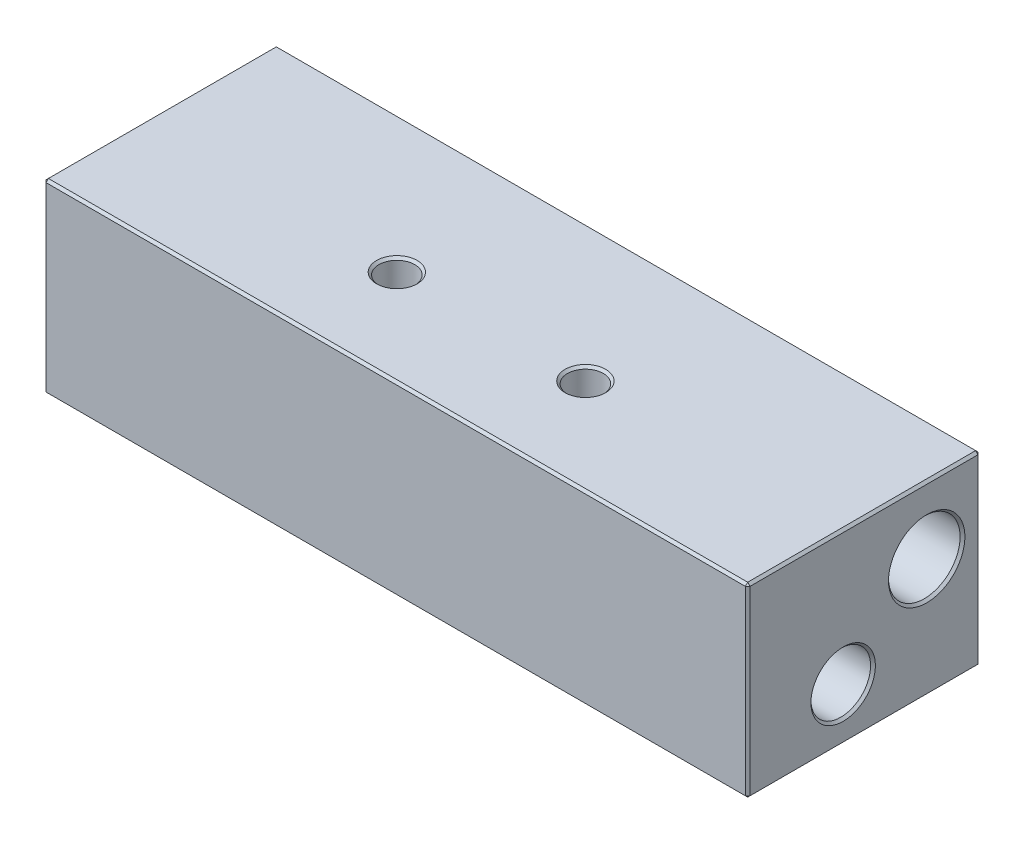
ISO-10303-21;
HEADER;
FILE_DESCRIPTION(('STEP AP214'),'2;1');
FILE_NAME('part.step','',(''),(''),'','','');
FILE_SCHEMA(('AUTOMOTIVE_DESIGN { 1 0 10303 214 1 1 1 1 }'));
ENDSEC;
DATA;
#1=APPLICATION_CONTEXT('core data for automotive mechanical design processes');
#2=APPLICATION_PROTOCOL_DEFINITION('international standard','automotive_design',2000,#1);
#3=PRODUCT_CONTEXT('',#1,'mechanical');
#4=PRODUCT('Part','Part','',(#3));
#5=PRODUCT_RELATED_PRODUCT_CATEGORY('part','',(#4));
#6=PRODUCT_DEFINITION_FORMATION('','',#4);
#7=PRODUCT_DEFINITION_CONTEXT('part definition',#1,'design');
#8=PRODUCT_DEFINITION('design','',#6,#7);
#9=PRODUCT_DEFINITION_SHAPE('','',#8);
#10=(LENGTH_UNIT() NAMED_UNIT(*) SI_UNIT(.MILLI.,.METRE.));
#11=(NAMED_UNIT(*) PLANE_ANGLE_UNIT() SI_UNIT($,.RADIAN.));
#12=(NAMED_UNIT(*) SI_UNIT($,.STERADIAN.) SOLID_ANGLE_UNIT());
#13=UNCERTAINTY_MEASURE_WITH_UNIT(LENGTH_MEASURE(1.E-05),#10,'distance_accuracy_value','');
#14=(GEOMETRIC_REPRESENTATION_CONTEXT(3) GLOBAL_UNCERTAINTY_ASSIGNED_CONTEXT((#13)) GLOBAL_UNIT_ASSIGNED_CONTEXT((#10,
#11,#12)) REPRESENTATION_CONTEXT('',''));
#15=CARTESIAN_POINT('',(0.,0.,0.));
#16=DIRECTION('',(0.,0.,1.));
#17=DIRECTION('',(1.,0.,0.));
#18=AXIS2_PLACEMENT_3D('',#15,#16,#17);
#19=CARTESIAN_POINT('',(0.,0.,19.5));
#20=DIRECTION('',(1.,0.,0.));
#21=DIRECTION('',(0.,0.,-1.));
#22=AXIS2_PLACEMENT_3D('',#19,#20,#21);
#23=PLANE('',#22);
#24=DIRECTION('',(0.,0.,-1.));
#25=VECTOR('',#24,1.);
#26=CARTESIAN_POINT('',(0.,15.4,19.5));
#27=LINE('',#26,#25);
#28=CARTESIAN_POINT('',(0.,15.4,19.3));
#29=VERTEX_POINT('',#28);
#30=CARTESIAN_POINT('',(0.,15.4,0.199999999999999));
#31=VERTEX_POINT('',#30);
#32=EDGE_CURVE('E255',#29,#31,#27,.T.);
#33=ORIENTED_EDGE('',*,*,#32,.T.);
#34=DIRECTION('',(0.,-1.,0.));
#35=VECTOR('',#34,1.);
#36=CARTESIAN_POINT('',(0.,0.,0.199999999999999));
#37=LINE('',#36,#35);
#38=CARTESIAN_POINT('',(0.,0.199999999999999,0.199999999999999));
#39=VERTEX_POINT('',#38);
#40=EDGE_CURVE('E258',#31,#39,#37,.T.);
#41=ORIENTED_EDGE('',*,*,#40,.T.);
#42=DIRECTION('',(0.,0.,1.));
#43=VECTOR('',#42,1.);
#44=CARTESIAN_POINT('',(0.,0.199999999999999,19.5));
#45=LINE('',#44,#43);
#46=CARTESIAN_POINT('',(0.,0.199999999999999,19.3));
#47=VERTEX_POINT('',#46);
#48=EDGE_CURVE('E249',#39,#47,#45,.T.);
#49=ORIENTED_EDGE('',*,*,#48,.T.);
#50=DIRECTION('',(0.,1.,0.));
#51=VECTOR('',#50,1.);
#52=CARTESIAN_POINT('',(0.,0.,19.3));
#53=LINE('',#52,#51);
#54=EDGE_CURVE('E252',#47,#29,#53,.T.);
#55=ORIENTED_EDGE('',*,*,#54,.T.);
#56=EDGE_LOOP('',(#33,#41,#49,#55));
#57=FACE_BOUND('',#56,.T.);
#58=CARTESIAN_POINT('',(0.,10.7,10.4));
#59=DIRECTION('',(-1.,0.,0.));
#60=DIRECTION('',(0.,0.,1.));
#61=AXIS2_PLACEMENT_3D('',#58,#59,#60);
#62=CIRCLE('',#61,3.);
#63=CARTESIAN_POINT('',(0.,10.7,13.4));
#64=VERTEX_POINT('',#63);
#65=EDGE_CURVE('E381',#64,#64,#62,.T.);
#66=ORIENTED_EDGE('',*,*,#65,.F.);
#67=EDGE_LOOP('',(#66));
#68=FACE_BOUND('',#67,.T.);
#69=CARTESIAN_POINT('',(0.,4.6,4.5));
#70=DIRECTION('',(-1.,0.,0.));
#71=DIRECTION('',(0.,0.,1.));
#72=AXIS2_PLACEMENT_3D('',#69,#70,#71);
#73=CIRCLE('',#72,3.);
#74=CARTESIAN_POINT('',(0.,4.6,7.5));
#75=VERTEX_POINT('',#74);
#76=EDGE_CURVE('E367',#75,#75,#73,.T.);
#77=ORIENTED_EDGE('',*,*,#76,.F.);
#78=EDGE_LOOP('',(#77));
#79=FACE_BOUND('',#78,.T.);
#80=ADVANCED_FACE('F41',(#57,#68,#79),#23,.F.);
#81=CARTESIAN_POINT('',(0.,0.,19.5));
#82=DIRECTION('',(0.,1.,0.));
#83=DIRECTION('',(0.,0.,1.));
#84=AXIS2_PLACEMENT_3D('',#81,#82,#83);
#85=PLANE('',#84);
#86=DIRECTION('',(0.,0.,-1.));
#87=VECTOR('',#86,1.);
#88=CARTESIAN_POINT('',(0.199999999999992,0.,19.5));
#89=LINE('',#88,#87);
#90=CARTESIAN_POINT('',(0.199999999999992,0.,19.3));
#91=VERTEX_POINT('',#90);
#92=CARTESIAN_POINT('',(0.199999999999992,0.,0.199999999999992));
#93=VERTEX_POINT('',#92);
#94=EDGE_CURVE('E202',#91,#93,#89,.T.);
#95=ORIENTED_EDGE('',*,*,#94,.T.);
#96=DIRECTION('',(1.,0.,0.));
#97=VECTOR('',#96,1.);
#98=CARTESIAN_POINT('',(59.,0.,0.199999999999992));
#99=LINE('',#98,#97);
#100=CARTESIAN_POINT('',(58.8,0.,0.199999999999992));
#101=VERTEX_POINT('',#100);
#102=EDGE_CURVE('E211',#93,#101,#99,.T.);
#103=ORIENTED_EDGE('',*,*,#102,.T.);
#104=DIRECTION('',(0.,0.,1.));
#105=VECTOR('',#104,1.);
#106=CARTESIAN_POINT('',(58.8,0.,19.5));
#107=LINE('',#106,#105);
#108=CARTESIAN_POINT('',(58.8,0.,19.3));
#109=VERTEX_POINT('',#108);
#110=EDGE_CURVE('E208',#101,#109,#107,.T.);
#111=ORIENTED_EDGE('',*,*,#110,.T.);
#112=DIRECTION('',(-1.,0.,0.));
#113=VECTOR('',#112,1.);
#114=CARTESIAN_POINT('',(0.,0.,19.3));
#115=LINE('',#114,#113);
#116=EDGE_CURVE('E205',#109,#91,#115,.T.);
#117=ORIENTED_EDGE('',*,*,#116,.T.);
#118=EDGE_LOOP('',(#95,#103,#111,#117));
#119=FACE_BOUND('',#118,.T.);
#120=CARTESIAN_POINT('',(37.4,0.,11.5));
#121=DIRECTION('',(0.,1.,0.));
#122=DIRECTION('',(0.,0.,1.));
#123=AXIS2_PLACEMENT_3D('',#120,#121,#122);
#124=CIRCLE('',#123,1.69999999999999);
#125=CARTESIAN_POINT('',(37.4,0.,13.2));
#126=VERTEX_POINT('',#125);
#127=EDGE_CURVE('E198',#126,#126,#124,.T.);
#128=ORIENTED_EDGE('',*,*,#127,.T.);
#129=EDGE_LOOP('',(#128));
#130=FACE_BOUND('',#129,.T.);
#131=CARTESIAN_POINT('',(21.6,0.,11.5));
#132=DIRECTION('',(0.,1.,0.));
#133=DIRECTION('',(0.,0.,1.));
#134=AXIS2_PLACEMENT_3D('',#131,#132,#133);
#135=CIRCLE('',#134,1.69999999999999);
#136=CARTESIAN_POINT('',(21.6,0.,13.2));
#137=VERTEX_POINT('',#136);
#138=EDGE_CURVE('E194',#137,#137,#135,.T.);
#139=ORIENTED_EDGE('',*,*,#138,.T.);
#140=EDGE_LOOP('',(#139));
#141=FACE_BOUND('',#140,.T.);
#142=ADVANCED_FACE('F417',(#119,#130,#141),#85,.F.);
#143=CARTESIAN_POINT('',(59.,0.,19.5));
#144=DIRECTION('',(-1.,0.,0.));
#145=DIRECTION('',(0.,0.,1.));
#146=AXIS2_PLACEMENT_3D('',#143,#144,#145);
#147=PLANE('',#146);
#148=CARTESIAN_POINT('',(59.,10.,4.5));
#149=DIRECTION('',(-1.,0.,0.));
#150=DIRECTION('',(0.,0.,1.));
#151=AXIS2_PLACEMENT_3D('',#148,#149,#150);
#152=CIRCLE('',#151,3.19999999999999);
#153=CARTESIAN_POINT('',(59.,10.,7.69999999999999));
#154=VERTEX_POINT('',#153);
#155=EDGE_CURVE('E186',#154,#154,#152,.T.);
#156=ORIENTED_EDGE('',*,*,#155,.T.);
#157=EDGE_LOOP('',(#156));
#158=FACE_BOUND('',#157,.T.);
#159=DIRECTION('',(0.,0.,-1.));
#160=VECTOR('',#159,1.);
#161=CARTESIAN_POINT('',(59.,0.199999999999999,19.5));
#162=LINE('',#161,#160);
#163=CARTESIAN_POINT('',(59.,0.199999999999999,19.3));
#164=VERTEX_POINT('',#163);
#165=CARTESIAN_POINT('',(59.,0.199999999999999,0.199999999999992));
#166=VERTEX_POINT('',#165);
#167=EDGE_CURVE('E138',#164,#166,#162,.T.);
#168=ORIENTED_EDGE('',*,*,#167,.T.);
#169=DIRECTION('',(0.,1.,0.));
#170=VECTOR('',#169,1.);
#171=CARTESIAN_POINT('',(59.,15.6,0.199999999999992));
#172=LINE('',#171,#170);
#173=CARTESIAN_POINT('',(59.,15.4,0.199999999999992));
#174=VERTEX_POINT('',#173);
#175=EDGE_CURVE('E183',#166,#174,#172,.T.);
#176=ORIENTED_EDGE('',*,*,#175,.T.);
#177=DIRECTION('',(0.,0.,1.));
#178=VECTOR('',#177,1.);
#179=CARTESIAN_POINT('',(59.,15.4,19.5));
#180=LINE('',#179,#178);
#181=CARTESIAN_POINT('',(59.,15.4,19.3));
#182=VERTEX_POINT('',#181);
#183=EDGE_CURVE('E141',#174,#182,#180,.T.);
#184=ORIENTED_EDGE('',*,*,#183,.T.);
#185=DIRECTION('',(0.,-1.,0.));
#186=VECTOR('',#185,1.);
#187=CARTESIAN_POINT('',(59.,0.,19.3));
#188=LINE('',#187,#186);
#189=EDGE_CURVE('E132',#182,#164,#188,.T.);
#190=ORIENTED_EDGE('',*,*,#189,.T.);
#191=EDGE_LOOP('',(#168,#176,#184,#190));
#192=FACE_BOUND('',#191,.T.);
#193=CARTESIAN_POINT('',(59.,4.4,11.5));
#194=DIRECTION('',(-1.,0.,0.));
#195=DIRECTION('',(0.,0.,1.));
#196=AXIS2_PLACEMENT_3D('',#193,#194,#195);
#197=CIRCLE('',#196,2.70000000000001);
#198=CARTESIAN_POINT('',(59.,4.4,14.2));
#199=VERTEX_POINT('',#198);
#200=EDGE_CURVE('E173',#199,#199,#197,.T.);
#201=ORIENTED_EDGE('',*,*,#200,.T.);
#202=EDGE_LOOP('',(#201));
#203=FACE_BOUND('',#202,.T.);
#204=ADVANCED_FACE('F134',(#158,#192,#203),#147,.F.);
#205=CARTESIAN_POINT('',(0.,15.6,19.5));
#206=DIRECTION('',(0.,-1.,0.));
#207=DIRECTION('',(0.,0.,-1.));
#208=AXIS2_PLACEMENT_3D('',#205,#206,#207);
#209=PLANE('',#208);
#210=DIRECTION('',(1.,0.,0.));
#211=VECTOR('',#210,1.);
#212=CARTESIAN_POINT('',(0.,15.6,19.3));
#213=LINE('',#212,#211);
#214=CARTESIAN_POINT('',(0.199999999999992,15.6,19.3));
#215=VERTEX_POINT('',#214);
#216=CARTESIAN_POINT('',(58.8,15.6,19.3));
#217=VERTEX_POINT('',#216);
#218=EDGE_CURVE('E239',#215,#217,#213,.T.);
#219=ORIENTED_EDGE('',*,*,#218,.T.);
#220=DIRECTION('',(0.,0.,-1.));
#221=VECTOR('',#220,1.);
#222=CARTESIAN_POINT('',(58.8,15.6,19.5));
#223=LINE('',#222,#221);
#224=CARTESIAN_POINT('',(58.8,15.6,0.199999999999992));
#225=VERTEX_POINT('',#224);
#226=EDGE_CURVE('E246',#217,#225,#223,.T.);
#227=ORIENTED_EDGE('',*,*,#226,.T.);
#228=DIRECTION('',(-1.,0.,0.));
#229=VECTOR('',#228,1.);
#230=CARTESIAN_POINT('',(0.,15.6,0.199999999999992));
#231=LINE('',#230,#229);
#232=CARTESIAN_POINT('',(0.199999999999992,15.6,0.199999999999992));
#233=VERTEX_POINT('',#232);
#234=EDGE_CURVE('E242',#225,#233,#231,.T.);
#235=ORIENTED_EDGE('',*,*,#234,.T.);
#236=DIRECTION('',(0.,0.,1.));
#237=VECTOR('',#236,1.);
#238=CARTESIAN_POINT('',(0.199999999999992,15.6,19.5));
#239=LINE('',#238,#237);
#240=EDGE_CURVE('E236',#233,#215,#239,.T.);
#241=ORIENTED_EDGE('',*,*,#240,.T.);
#242=EDGE_LOOP('',(#219,#227,#235,#241));
#243=FACE_BOUND('',#242,.T.);
#244=CARTESIAN_POINT('',(37.4,15.6,11.5));
#245=DIRECTION('',(0.,-1.,0.));
#246=DIRECTION('',(0.,0.,-1.));
#247=AXIS2_PLACEMENT_3D('',#244,#245,#246);
#248=CIRCLE('',#247,1.7);
#249=CARTESIAN_POINT('',(37.4,15.6,9.8));
#250=VERTEX_POINT('',#249);
#251=EDGE_CURVE('E232',#250,#250,#248,.T.);
#252=ORIENTED_EDGE('',*,*,#251,.T.);
#253=EDGE_LOOP('',(#252));
#254=FACE_BOUND('',#253,.T.);
#255=CARTESIAN_POINT('',(21.6,15.6,11.5));
#256=DIRECTION('',(0.,-1.,0.));
#257=DIRECTION('',(0.,0.,-1.));
#258=AXIS2_PLACEMENT_3D('',#255,#256,#257);
#259=CIRCLE('',#258,1.7);
#260=CARTESIAN_POINT('',(21.6,15.6,9.8));
#261=VERTEX_POINT('',#260);
#262=EDGE_CURVE('E228',#261,#261,#259,.T.);
#263=ORIENTED_EDGE('',*,*,#262,.T.);
#264=EDGE_LOOP('',(#263));
#265=FACE_BOUND('',#264,.T.);
#266=ADVANCED_FACE('F428',(#243,#254,#265),#209,.F.);
#267=CARTESIAN_POINT('',(0.,0.,19.5));
#268=DIRECTION('',(0.,0.,-1.));
#269=DIRECTION('',(-1.,0.,0.));
#270=AXIS2_PLACEMENT_3D('',#267,#268,#269);
#271=PLANE('',#270);
#272=DIRECTION('',(0.,1.,0.));
#273=VECTOR('',#272,1.);
#274=CARTESIAN_POINT('',(58.8,0.,19.5));
#275=LINE('',#274,#273);
#276=CARTESIAN_POINT('',(58.8,0.199999999999999,19.5));
#277=VERTEX_POINT('',#276);
#278=CARTESIAN_POINT('',(58.8,15.4,19.5));
#279=VERTEX_POINT('',#278);
#280=EDGE_CURVE('E60',#277,#279,#275,.T.);
#281=ORIENTED_EDGE('',*,*,#280,.T.);
#282=DIRECTION('',(-1.,0.,0.));
#283=VECTOR('',#282,1.);
#284=CARTESIAN_POINT('',(0.,15.4,19.5));
#285=LINE('',#284,#283);
#286=CARTESIAN_POINT('',(0.199999999999992,15.4,19.5));
#287=VERTEX_POINT('',#286);
#288=EDGE_CURVE('E269',#279,#287,#285,.T.);
#289=ORIENTED_EDGE('',*,*,#288,.T.);
#290=DIRECTION('',(0.,-1.,0.));
#291=VECTOR('',#290,1.);
#292=CARTESIAN_POINT('',(0.199999999999992,0.,19.5));
#293=LINE('',#292,#291);
#294=CARTESIAN_POINT('',(0.199999999999992,0.199999999999999,19.5));
#295=VERTEX_POINT('',#294);
#296=EDGE_CURVE('E262',#287,#295,#293,.T.);
#297=ORIENTED_EDGE('',*,*,#296,.T.);
#298=DIRECTION('',(1.,0.,0.));
#299=VECTOR('',#298,1.);
#300=CARTESIAN_POINT('',(0.,0.199999999999999,19.5));
#301=LINE('',#300,#299);
#302=EDGE_CURVE('E65',#295,#277,#301,.T.);
#303=ORIENTED_EDGE('',*,*,#302,.T.);
#304=EDGE_LOOP('',(#281,#289,#297,#303));
#305=FACE_BOUND('',#304,.T.);
#306=ADVANCED_FACE('F432',(#305),#271,.F.);
#307=CARTESIAN_POINT('',(0.,0.,0.));
#308=DIRECTION('',(0.,0.,-1.));
#309=DIRECTION('',(-1.,0.,0.));
#310=AXIS2_PLACEMENT_3D('',#307,#308,#309);
#311=PLANE('',#310);
#312=DIRECTION('',(0.,-1.,0.));
#313=VECTOR('',#312,1.);
#314=CARTESIAN_POINT('',(58.8,0.,0.));
#315=LINE('',#314,#313);
#316=CARTESIAN_POINT('',(58.8,15.4,0.));
#317=VERTEX_POINT('',#316);
#318=CARTESIAN_POINT('',(58.8,0.199999999999999,0.));
#319=VERTEX_POINT('',#318);
#320=EDGE_CURVE('E221',#317,#319,#315,.T.);
#321=ORIENTED_EDGE('',*,*,#320,.T.);
#322=DIRECTION('',(-1.,0.,0.));
#323=VECTOR('',#322,1.);
#324=CARTESIAN_POINT('',(0.,0.199999999999999,0.));
#325=LINE('',#324,#323);
#326=CARTESIAN_POINT('',(0.199999999999992,0.199999999999999,0.));
#327=VERTEX_POINT('',#326);
#328=EDGE_CURVE('E224',#319,#327,#325,.T.);
#329=ORIENTED_EDGE('',*,*,#328,.T.);
#330=DIRECTION('',(0.,1.,0.));
#331=VECTOR('',#330,1.);
#332=CARTESIAN_POINT('',(0.199999999999992,15.6,0.));
#333=LINE('',#332,#331);
#334=CARTESIAN_POINT('',(0.199999999999992,15.4,0.));
#335=VERTEX_POINT('',#334);
#336=EDGE_CURVE('E215',#327,#335,#333,.T.);
#337=ORIENTED_EDGE('',*,*,#336,.T.);
#338=DIRECTION('',(1.,0.,0.));
#339=VECTOR('',#338,1.);
#340=CARTESIAN_POINT('',(59.,15.4,0.));
#341=LINE('',#340,#339);
#342=EDGE_CURVE('E218',#335,#317,#341,.T.);
#343=ORIENTED_EDGE('',*,*,#342,.T.);
#344=EDGE_LOOP('',(#321,#329,#337,#343));
#345=FACE_BOUND('',#344,.T.);
#346=ADVANCED_FACE('F434',(#345),#311,.T.);
#347=CARTESIAN_POINT('',(2.,4.6,4.5));
#348=DIRECTION('',(-1.,0.,0.));
#349=DIRECTION('',(0.,0.,1.));
#350=AXIS2_PLACEMENT_3D('',#347,#348,#349);
#351=CYLINDRICAL_SURFACE('',#350,3.);
#352=CARTESIAN_POINT('',(2.,4.6,4.5));
#353=DIRECTION('',(-1.,0.,0.));
#354=DIRECTION('',(0.,0.,1.));
#355=AXIS2_PLACEMENT_3D('',#352,#353,#354);
#356=CIRCLE('',#355,3.);
#357=CARTESIAN_POINT('',(2.,4.6,7.5));
#358=VERTEX_POINT('',#357);
#359=EDGE_CURVE('E373',#358,#358,#356,.T.);
#360=ORIENTED_EDGE('',*,*,#359,.F.);
#361=EDGE_LOOP('',(#360));
#362=FACE_BOUND('',#361,.T.);
#363=ORIENTED_EDGE('',*,*,#76,.T.);
#364=EDGE_LOOP('',(#363));
#365=FACE_BOUND('',#364,.T.);
#366=ADVANCED_FACE('F437',(#362,#365),#351,.F.);
#367=CARTESIAN_POINT('',(2.,4.6,4.5));
#368=DIRECTION('',(-1.,0.,0.));
#369=DIRECTION('',(0.,0.,1.));
#370=AXIS2_PLACEMENT_3D('',#367,#368,#369);
#371=PLANE('',#370);
#372=ORIENTED_EDGE('',*,*,#359,.T.);
#373=EDGE_LOOP('',(#372));
#374=FACE_BOUND('',#373,.T.);
#375=ADVANCED_FACE('F443',(#374),#371,.T.);
#376=CARTESIAN_POINT('',(2.,10.7,10.4));
#377=DIRECTION('',(-1.,0.,0.));
#378=DIRECTION('',(0.,0.,1.));
#379=AXIS2_PLACEMENT_3D('',#376,#377,#378);
#380=CYLINDRICAL_SURFACE('',#379,3.);
#381=CARTESIAN_POINT('',(2.,10.7,10.4));
#382=DIRECTION('',(-1.,0.,0.));
#383=DIRECTION('',(0.,0.,1.));
#384=AXIS2_PLACEMENT_3D('',#381,#382,#383);
#385=CIRCLE('',#384,3.);
#386=CARTESIAN_POINT('',(2.,10.7,13.4));
#387=VERTEX_POINT('',#386);
#388=EDGE_CURVE('E376',#387,#387,#385,.T.);
#389=ORIENTED_EDGE('',*,*,#388,.F.);
#390=EDGE_LOOP('',(#389));
#391=FACE_BOUND('',#390,.T.);
#392=ORIENTED_EDGE('',*,*,#65,.T.);
#393=EDGE_LOOP('',(#392));
#394=FACE_BOUND('',#393,.T.);
#395=ADVANCED_FACE('F447',(#391,#394),#380,.F.);
#396=CARTESIAN_POINT('',(2.,10.7,10.4));
#397=DIRECTION('',(-1.,0.,0.));
#398=DIRECTION('',(0.,0.,1.));
#399=AXIS2_PLACEMENT_3D('',#396,#397,#398);
#400=PLANE('',#399);
#401=ORIENTED_EDGE('',*,*,#388,.T.);
#402=EDGE_LOOP('',(#401));
#403=FACE_BOUND('',#402,.T.);
#404=ADVANCED_FACE('F451',(#403),#400,.T.);
#405=CARTESIAN_POINT('',(54.,4.4,11.5));
#406=DIRECTION('',(1.,0.,0.));
#407=DIRECTION('',(0.,0.,-1.));
#408=AXIS2_PLACEMENT_3D('',#405,#406,#407);
#409=CYLINDRICAL_SURFACE('',#408,2.5);
#410=CARTESIAN_POINT('',(58.8,4.4,11.5));
#411=DIRECTION('',(-1.,0.,0.));
#412=DIRECTION('',(0.,0.,1.));
#413=AXIS2_PLACEMENT_3D('',#410,#411,#412);
#414=CIRCLE('',#413,2.5);
#415=CARTESIAN_POINT('',(58.8,4.4,14.));
#416=VERTEX_POINT('',#415);
#417=EDGE_CURVE('E272',#416,#416,#414,.F.);
#418=ORIENTED_EDGE('',*,*,#417,.T.);
#419=EDGE_LOOP('',(#418));
#420=FACE_BOUND('',#419,.T.);
#421=CARTESIAN_POINT('',(54.,4.4,11.5));
#422=DIRECTION('',(1.,0.,0.));
#423=DIRECTION('',(0.,0.,-1.));
#424=AXIS2_PLACEMENT_3D('',#421,#422,#423);
#425=CIRCLE('',#424,2.5);
#426=CARTESIAN_POINT('',(54.,4.4,9.));
#427=VERTEX_POINT('',#426);
#428=EDGE_CURVE('E360',#427,#427,#425,.T.);
#429=ORIENTED_EDGE('',*,*,#428,.F.);
#430=EDGE_LOOP('',(#429));
#431=FACE_BOUND('',#430,.T.);
#432=ADVANCED_FACE('F455',(#420,#431),#409,.F.);
#433=CARTESIAN_POINT('',(54.,4.4,11.5));
#434=DIRECTION('',(1.,0.,0.));
#435=DIRECTION('',(0.,0.,-1.));
#436=AXIS2_PLACEMENT_3D('',#433,#434,#435);
#437=PLANE('',#436);
#438=ORIENTED_EDGE('',*,*,#428,.T.);
#439=EDGE_LOOP('',(#438));
#440=FACE_BOUND('',#439,.T.);
#441=ADVANCED_FACE('F459',(#440),#437,.T.);
#442=CARTESIAN_POINT('',(54.,10.,4.5));
#443=DIRECTION('',(1.,0.,0.));
#444=DIRECTION('',(0.,0.,-1.));
#445=AXIS2_PLACEMENT_3D('',#442,#443,#444);
#446=CYLINDRICAL_SURFACE('',#445,3.);
#447=CARTESIAN_POINT('',(58.8,10.,4.5));
#448=DIRECTION('',(-1.,0.,0.));
#449=DIRECTION('',(0.,0.,1.));
#450=AXIS2_PLACEMENT_3D('',#447,#448,#449);
#451=CIRCLE('',#450,3.);
#452=CARTESIAN_POINT('',(58.8,10.,7.5));
#453=VERTEX_POINT('',#452);
#454=EDGE_CURVE('E177',#453,#453,#451,.F.);
#455=ORIENTED_EDGE('',*,*,#454,.T.);
#456=EDGE_LOOP('',(#455));
#457=FACE_BOUND('',#456,.T.);
#458=CARTESIAN_POINT('',(54.2,10.,4.5));
#459=DIRECTION('',(1.,0.,0.));
#460=DIRECTION('',(0.,0.,-1.));
#461=AXIS2_PLACEMENT_3D('',#458,#459,#460);
#462=CIRCLE('',#461,3.);
#463=CARTESIAN_POINT('',(54.2,10.,1.5));
#464=VERTEX_POINT('',#463);
#465=EDGE_CURVE('E380',#464,#464,#462,.F.);
#466=ORIENTED_EDGE('',*,*,#465,.T.);
#467=EDGE_LOOP('',(#466));
#468=FACE_BOUND('',#467,.T.);
#469=ADVANCED_FACE('F394',(#457,#468),#446,.F.);
#470=CARTESIAN_POINT('',(54.,10.,4.5));
#471=DIRECTION('',(1.,0.,0.));
#472=DIRECTION('',(0.,0.,-1.));
#473=AXIS2_PLACEMENT_3D('',#470,#471,#472);
#474=PLANE('',#473);
#475=CARTESIAN_POINT('',(54.,10.,4.5));
#476=DIRECTION('',(1.,0.,0.));
#477=DIRECTION('',(0.,0.,-1.));
#478=AXIS2_PLACEMENT_3D('',#475,#476,#477);
#479=CIRCLE('',#478,2.8);
#480=CARTESIAN_POINT('',(54.,10.,1.7));
#481=VERTEX_POINT('',#480);
#482=EDGE_CURVE('E190',#481,#481,#479,.T.);
#483=ORIENTED_EDGE('',*,*,#482,.T.);
#484=EDGE_LOOP('',(#483));
#485=FACE_BOUND('',#484,.T.);
#486=ADVANCED_FACE('F465',(#485),#474,.T.);
#487=CARTESIAN_POINT('',(37.4,15.6,11.5));
#488=DIRECTION('',(0.,-1.,0.));
#489=DIRECTION('',(0.,0.,-1.));
#490=AXIS2_PLACEMENT_3D('',#487,#488,#489);
#491=CYLINDRICAL_SURFACE('',#490,1.5);
#492=CARTESIAN_POINT('',(37.4,15.4,11.5));
#493=DIRECTION('',(0.,-1.,0.));
#494=DIRECTION('',(0.,0.,-1.));
#495=AXIS2_PLACEMENT_3D('',#492,#493,#494);
#496=CIRCLE('',#495,1.5);
#497=CARTESIAN_POINT('',(37.4,15.4,10.));
#498=VERTEX_POINT('',#497);
#499=EDGE_CURVE('E280',#498,#498,#496,.F.);
#500=ORIENTED_EDGE('',*,*,#499,.T.);
#501=EDGE_LOOP('',(#500));
#502=FACE_BOUND('',#501,.T.);
#503=CARTESIAN_POINT('',(37.4,0.199999999999987,11.5));
#504=DIRECTION('',(0.,1.,0.));
#505=DIRECTION('',(0.,0.,1.));
#506=AXIS2_PLACEMENT_3D('',#503,#504,#505);
#507=CIRCLE('',#506,1.5);
#508=CARTESIAN_POINT('',(37.4,0.199999999999987,13.));
#509=VERTEX_POINT('',#508);
#510=EDGE_CURVE('E276',#509,#509,#507,.F.);
#511=ORIENTED_EDGE('',*,*,#510,.T.);
#512=EDGE_LOOP('',(#511));
#513=FACE_BOUND('',#512,.T.);
#514=ADVANCED_FACE('F410',(#502,#513),#491,.F.);
#515=CARTESIAN_POINT('',(21.6,15.6,11.5));
#516=DIRECTION('',(0.,-1.,0.));
#517=DIRECTION('',(0.,0.,-1.));
#518=AXIS2_PLACEMENT_3D('',#515,#516,#517);
#519=CYLINDRICAL_SURFACE('',#518,1.5);
#520=CARTESIAN_POINT('',(21.6,15.4,11.5));
#521=DIRECTION('',(0.,-1.,0.));
#522=DIRECTION('',(0.,0.,-1.));
#523=AXIS2_PLACEMENT_3D('',#520,#521,#522);
#524=CIRCLE('',#523,1.5);
#525=CARTESIAN_POINT('',(21.6,15.4,10.));
#526=VERTEX_POINT('',#525);
#527=EDGE_CURVE('E11',#526,#526,#524,.F.);
#528=ORIENTED_EDGE('',*,*,#527,.T.);
#529=EDGE_LOOP('',(#528));
#530=FACE_BOUND('',#529,.T.);
#531=CARTESIAN_POINT('',(21.6,0.19999999999999,11.5));
#532=DIRECTION('',(0.,1.,0.));
#533=DIRECTION('',(0.,0.,1.));
#534=AXIS2_PLACEMENT_3D('',#531,#532,#533);
#535=CIRCLE('',#534,1.5);
#536=CARTESIAN_POINT('',(21.6,0.19999999999999,13.));
#537=VERTEX_POINT('',#536);
#538=EDGE_CURVE('E52',#537,#537,#535,.F.);
#539=ORIENTED_EDGE('',*,*,#538,.T.);
#540=EDGE_LOOP('',(#539));
#541=FACE_BOUND('',#540,.T.);
#542=ADVANCED_FACE('F400',(#530,#541),#519,.F.);
#543=CARTESIAN_POINT('',(58.8,10.,4.5));
#544=DIRECTION('',(1.,0.,0.));
#545=DIRECTION('',(0.,0.,-1.));
#546=AXIS2_PLACEMENT_3D('',#543,#544,#545);
#547=CONICAL_SURFACE('',#546,3.,0.785398163397451);
#548=ORIENTED_EDGE('',*,*,#155,.F.);
#549=EDGE_LOOP('',(#548));
#550=FACE_BOUND('',#549,.T.);
#551=ORIENTED_EDGE('',*,*,#454,.F.);
#552=EDGE_LOOP('',(#551));
#553=FACE_BOUND('',#552,.T.);
#554=ADVANCED_FACE('F397',(#550,#553),#547,.F.);
#555=CARTESIAN_POINT('',(54.,10.,4.5));
#556=DIRECTION('',(1.,0.,0.));
#557=DIRECTION('',(0.,0.,-1.));
#558=AXIS2_PLACEMENT_3D('',#555,#556,#557);
#559=CONICAL_SURFACE('',#558,2.8,0.785398163397462);
#560=ORIENTED_EDGE('',*,*,#465,.F.);
#561=EDGE_LOOP('',(#560));
#562=FACE_BOUND('',#561,.T.);
#563=ORIENTED_EDGE('',*,*,#482,.F.);
#564=EDGE_LOOP('',(#563));
#565=FACE_BOUND('',#564,.T.);
#566=ADVANCED_FACE('F399',(#562,#565),#559,.F.);
#567=CARTESIAN_POINT('',(0.,15.4,19.5));
#568=DIRECTION('',(0.,-0.70710678118656,-0.707106781186535));
#569=DIRECTION('',(-1.,0.,0.));
#570=AXIS2_PLACEMENT_3D('',#567,#568,#569);
#571=PLANE('',#570);
#572=DIRECTION('',(0.,-0.707106781186535,0.70710678118656));
#573=VECTOR('',#572,1.);
#574=CARTESIAN_POINT('',(0.199999999999992,15.4,19.5));
#575=LINE('',#574,#573);
#576=EDGE_CURVE('E46',#287,#215,#575,.F.);
#577=ORIENTED_EDGE('',*,*,#576,.F.);
#578=ORIENTED_EDGE('',*,*,#288,.F.);
#579=DIRECTION('',(0.,0.707106781186535,-0.70710678118656));
#580=VECTOR('',#579,1.);
#581=CARTESIAN_POINT('',(58.8,15.6,19.3));
#582=LINE('',#581,#580);
#583=EDGE_CURVE('E351',#217,#279,#582,.F.);
#584=ORIENTED_EDGE('',*,*,#583,.F.);
#585=ORIENTED_EDGE('',*,*,#218,.F.);
#586=EDGE_LOOP('',(#577,#578,#584,#585));
#587=FACE_BOUND('',#586,.T.);
#588=ADVANCED_FACE('F407',(#587),#571,.F.);
#589=CARTESIAN_POINT('',(0.199999999999992,15.4,19.5));
#590=DIRECTION('',(-0.577350269189646,0.577350269189626,0.577350269189606));
#591=DIRECTION('',(-0.707106781186535,-0.70710678118656,0.));
#592=AXIS2_PLACEMENT_3D('',#589,#590,#591);
#593=PLANE('',#592);
#594=DIRECTION('',(-0.707106781186535,0.,-0.70710678118656));
#595=VECTOR('',#594,1.);
#596=CARTESIAN_POINT('',(0.199999999999992,15.4,19.5));
#597=LINE('',#596,#595);
#598=EDGE_CURVE('E344',#287,#29,#597,.T.);
#599=ORIENTED_EDGE('',*,*,#598,.F.);
#600=ORIENTED_EDGE('',*,*,#576,.T.);
#601=DIRECTION('',(0.707106781186535,0.70710678118656,0.));
#602=VECTOR('',#601,1.);
#603=CARTESIAN_POINT('',(0.0999999999999959,15.5,19.3));
#604=LINE('',#603,#602);
#605=EDGE_CURVE('E348',#29,#215,#604,.T.);
#606=ORIENTED_EDGE('',*,*,#605,.F.);
#607=EDGE_LOOP('',(#599,#600,#606));
#608=FACE_BOUND('',#607,.T.);
#609=ADVANCED_FACE('F519',(#608),#593,.T.);
#610=CARTESIAN_POINT('',(58.8,15.6,19.3));
#611=DIRECTION('',(0.577350269189646,0.577350269189626,0.577350269189606));
#612=DIRECTION('',(-0.707106781186535,0.70710678118656,0.));
#613=AXIS2_PLACEMENT_3D('',#610,#611,#612);
#614=PLANE('',#613);
#615=DIRECTION('',(0.707106781186535,-0.70710678118656,0.));
#616=VECTOR('',#615,1.);
#617=CARTESIAN_POINT('',(58.8,15.6,19.3));
#618=LINE('',#617,#616);
#619=EDGE_CURVE('E338',#217,#182,#618,.T.);
#620=ORIENTED_EDGE('',*,*,#619,.F.);
#621=ORIENTED_EDGE('',*,*,#583,.T.);
#622=DIRECTION('',(-0.707106781186535,0.,0.70710678118656));
#623=VECTOR('',#622,1.);
#624=CARTESIAN_POINT('',(58.9,15.4,19.4));
#625=LINE('',#624,#623);
#626=EDGE_CURVE('E341',#182,#279,#625,.T.);
#627=ORIENTED_EDGE('',*,*,#626,.F.);
#628=EDGE_LOOP('',(#620,#621,#627));
#629=FACE_BOUND('',#628,.T.);
#630=ADVANCED_FACE('F526',(#629),#614,.T.);
#631=CARTESIAN_POINT('',(0.,15.4,19.5));
#632=DIRECTION('',(0.70710678118656,-0.707106781186535,0.));
#633=DIRECTION('',(0.,0.,-1.));
#634=AXIS2_PLACEMENT_3D('',#631,#632,#633);
#635=PLANE('',#634);
#636=ORIENTED_EDGE('',*,*,#605,.T.);
#637=ORIENTED_EDGE('',*,*,#240,.F.);
#638=DIRECTION('',(-0.707106781186535,-0.70710678118656,0.));
#639=VECTOR('',#638,1.);
#640=CARTESIAN_POINT('',(0.199999999999992,15.6,0.199999999999992));
#641=LINE('',#640,#639);
#642=EDGE_CURVE('E331',#31,#233,#641,.F.);
#643=ORIENTED_EDGE('',*,*,#642,.F.);
#644=ORIENTED_EDGE('',*,*,#32,.F.);
#645=EDGE_LOOP('',(#636,#637,#643,#644));
#646=FACE_BOUND('',#645,.T.);
#647=ADVANCED_FACE('F532',(#646),#635,.F.);
#648=CARTESIAN_POINT('',(0.199999999999992,0.,19.5));
#649=DIRECTION('',(0.70710678118656,0.,-0.707106781186535));
#650=DIRECTION('',(0.,-1.,0.));
#651=AXIS2_PLACEMENT_3D('',#648,#649,#650);
#652=PLANE('',#651);
#653=ORIENTED_EDGE('',*,*,#598,.T.);
#654=ORIENTED_EDGE('',*,*,#54,.F.);
#655=DIRECTION('',(0.707106781186535,0.,0.70710678118656));
#656=VECTOR('',#655,1.);
#657=CARTESIAN_POINT('',(0.0999999999999959,0.199999999999999,19.4));
#658=LINE('',#657,#656);
#659=EDGE_CURVE('E327',#295,#47,#658,.F.);
#660=ORIENTED_EDGE('',*,*,#659,.F.);
#661=ORIENTED_EDGE('',*,*,#296,.F.);
#662=EDGE_LOOP('',(#653,#654,#660,#661));
#663=FACE_BOUND('',#662,.T.);
#664=ADVANCED_FACE('F538',(#663),#652,.F.);
#665=CARTESIAN_POINT('',(0.,0.199999999999999,19.5));
#666=DIRECTION('',(0.,0.707106781186535,-0.70710678118656));
#667=DIRECTION('',(1.,0.,0.));
#668=AXIS2_PLACEMENT_3D('',#665,#666,#667);
#669=PLANE('',#668);
#670=DIRECTION('',(0.,0.70710678118656,0.707106781186535));
#671=VECTOR('',#670,1.);
#672=CARTESIAN_POINT('',(58.8,0.0999999999999994,19.4));
#673=LINE('',#672,#671);
#674=EDGE_CURVE('E155',#277,#109,#673,.F.);
#675=ORIENTED_EDGE('',*,*,#674,.F.);
#676=ORIENTED_EDGE('',*,*,#302,.F.);
#677=DIRECTION('',(0.,-0.70710678118656,-0.707106781186535));
#678=VECTOR('',#677,1.);
#679=CARTESIAN_POINT('',(0.199999999999992,0.,19.3));
#680=LINE('',#679,#678);
#681=EDGE_CURVE('E323',#91,#295,#680,.F.);
#682=ORIENTED_EDGE('',*,*,#681,.F.);
#683=ORIENTED_EDGE('',*,*,#116,.F.);
#684=EDGE_LOOP('',(#675,#676,#682,#683));
#685=FACE_BOUND('',#684,.T.);
#686=ADVANCED_FACE('F545',(#685),#669,.F.);
#687=CARTESIAN_POINT('',(58.8,0.,19.5));
#688=DIRECTION('',(-0.70710678118656,0.,-0.707106781186535));
#689=DIRECTION('',(0.,1.,0.));
#690=AXIS2_PLACEMENT_3D('',#687,#688,#689);
#691=PLANE('',#690);
#692=ORIENTED_EDGE('',*,*,#626,.T.);
#693=ORIENTED_EDGE('',*,*,#280,.F.);
#694=DIRECTION('',(0.707106781186535,0.,-0.70710678118656));
#695=VECTOR('',#694,1.);
#696=CARTESIAN_POINT('',(59.,0.199999999999999,19.3));
#697=LINE('',#696,#695);
#698=EDGE_CURVE('E148',#164,#277,#697,.F.);
#699=ORIENTED_EDGE('',*,*,#698,.F.);
#700=ORIENTED_EDGE('',*,*,#189,.F.);
#701=EDGE_LOOP('',(#692,#693,#699,#700));
#702=FACE_BOUND('',#701,.T.);
#703=ADVANCED_FACE('F150',(#702),#691,.F.);
#704=CARTESIAN_POINT('',(58.8,15.6,19.5));
#705=DIRECTION('',(-0.70710678118656,-0.707106781186535,0.));
#706=DIRECTION('',(0.,0.,-1.));
#707=AXIS2_PLACEMENT_3D('',#704,#705,#706);
#708=PLANE('',#707);
#709=ORIENTED_EDGE('',*,*,#619,.T.);
#710=ORIENTED_EDGE('',*,*,#183,.F.);
#711=DIRECTION('',(-0.707106781186535,0.70710678118656,0.));
#712=VECTOR('',#711,1.);
#713=CARTESIAN_POINT('',(59.,15.4,0.199999999999992));
#714=LINE('',#713,#712);
#715=EDGE_CURVE('E156',#225,#174,#714,.F.);
#716=ORIENTED_EDGE('',*,*,#715,.F.);
#717=ORIENTED_EDGE('',*,*,#226,.F.);
#718=EDGE_LOOP('',(#709,#710,#716,#717));
#719=FACE_BOUND('',#718,.T.);
#720=ADVANCED_FACE('F558',(#719),#708,.F.);
#721=CARTESIAN_POINT('',(0.,15.6,0.199999999999992));
#722=DIRECTION('',(0.,0.707106781186535,-0.70710678118656));
#723=DIRECTION('',(1.,0.,0.));
#724=AXIS2_PLACEMENT_3D('',#721,#722,#723);
#725=PLANE('',#724);
#726=DIRECTION('',(0.,-0.70710678118656,-0.707106781186535));
#727=VECTOR('',#726,1.);
#728=CARTESIAN_POINT('',(0.199999999999992,15.6,0.199999999999992));
#729=LINE('',#728,#727);
#730=EDGE_CURVE('E334',#233,#335,#729,.T.);
#731=ORIENTED_EDGE('',*,*,#730,.F.);
#732=ORIENTED_EDGE('',*,*,#234,.F.);
#733=DIRECTION('',(0.,0.70710678118656,0.707106781186535));
#734=VECTOR('',#733,1.);
#735=CARTESIAN_POINT('',(58.8,15.5,0.0999999999999959));
#736=LINE('',#735,#734);
#737=EDGE_CURVE('E314',#317,#225,#736,.T.);
#738=ORIENTED_EDGE('',*,*,#737,.F.);
#739=ORIENTED_EDGE('',*,*,#342,.F.);
#740=EDGE_LOOP('',(#731,#732,#738,#739));
#741=FACE_BOUND('',#740,.T.);
#742=ADVANCED_FACE('F564',(#741),#725,.T.);
#743=CARTESIAN_POINT('',(0.199999999999992,15.6,0.199999999999992));
#744=DIRECTION('',(-0.577350269189646,0.577350269189606,-0.577350269189626));
#745=DIRECTION('',(-0.707106781186535,0.,0.70710678118656));
#746=AXIS2_PLACEMENT_3D('',#743,#744,#745);
#747=PLANE('',#746);
#748=ORIENTED_EDGE('',*,*,#642,.T.);
#749=ORIENTED_EDGE('',*,*,#730,.T.);
#750=DIRECTION('',(-0.707106781186535,0.,0.70710678118656));
#751=VECTOR('',#750,1.);
#752=CARTESIAN_POINT('',(0.0999999999999959,15.4,0.0999999999999994));
#753=LINE('',#752,#751);
#754=EDGE_CURVE('E310',#31,#335,#753,.F.);
#755=ORIENTED_EDGE('',*,*,#754,.F.);
#756=EDGE_LOOP('',(#748,#749,#755));
#757=FACE_BOUND('',#756,.T.);
#758=ADVANCED_FACE('F571',(#757),#747,.T.);
#759=CARTESIAN_POINT('',(0.199999999999992,0.,19.3));
#760=DIRECTION('',(-0.577350269189646,-0.577350269189606,0.577350269189626));
#761=DIRECTION('',(0.707106781186535,0.,0.70710678118656));
#762=AXIS2_PLACEMENT_3D('',#759,#760,#761);
#763=PLANE('',#762);
#764=ORIENTED_EDGE('',*,*,#681,.T.);
#765=ORIENTED_EDGE('',*,*,#659,.T.);
#766=DIRECTION('',(-0.707106781186535,0.70710678118656,0.));
#767=VECTOR('',#766,1.);
#768=CARTESIAN_POINT('',(0.199999999999992,0.,19.3));
#769=LINE('',#768,#767);
#770=EDGE_CURVE('E164',#91,#47,#769,.T.);
#771=ORIENTED_EDGE('',*,*,#770,.F.);
#772=EDGE_LOOP('',(#764,#765,#771));
#773=FACE_BOUND('',#772,.T.);
#774=ADVANCED_FACE('F578',(#773),#763,.T.);
#775=CARTESIAN_POINT('',(59.,0.199999999999999,19.3));
#776=DIRECTION('',(0.577350269189646,-0.577350269189606,0.577350269189626));
#777=DIRECTION('',(0.707106781186535,0.,-0.70710678118656));
#778=AXIS2_PLACEMENT_3D('',#775,#776,#777);
#779=PLANE('',#778);
#780=ORIENTED_EDGE('',*,*,#698,.T.);
#781=ORIENTED_EDGE('',*,*,#674,.T.);
#782=DIRECTION('',(-0.707106781186535,-0.70710678118656,0.));
#783=VECTOR('',#782,1.);
#784=CARTESIAN_POINT('',(59.,0.199999999999999,19.3));
#785=LINE('',#784,#783);
#786=EDGE_CURVE('E159',#164,#109,#785,.T.);
#787=ORIENTED_EDGE('',*,*,#786,.F.);
#788=EDGE_LOOP('',(#780,#781,#787));
#789=FACE_BOUND('',#788,.T.);
#790=ADVANCED_FACE('F160',(#789),#779,.T.);
#791=CARTESIAN_POINT('',(59.,15.4,0.199999999999992));
#792=DIRECTION('',(0.577350269189626,0.577350269189606,-0.577350269189646));
#793=DIRECTION('',(-0.70710678118656,0.,-0.707106781186535));
#794=AXIS2_PLACEMENT_3D('',#791,#792,#793);
#795=PLANE('',#794);
#796=ORIENTED_EDGE('',*,*,#737,.T.);
#797=ORIENTED_EDGE('',*,*,#715,.T.);
#798=DIRECTION('',(-0.70710678118656,0.,-0.707106781186535));
#799=VECTOR('',#798,1.);
#800=CARTESIAN_POINT('',(59.,15.4,0.199999999999992));
#801=LINE('',#800,#799);
#802=EDGE_CURVE('E165',#317,#174,#801,.F.);
#803=ORIENTED_EDGE('',*,*,#802,.F.);
#804=EDGE_LOOP('',(#796,#797,#803));
#805=FACE_BOUND('',#804,.T.);
#806=ADVANCED_FACE('F591',(#805),#795,.T.);
#807=CARTESIAN_POINT('',(0.,0.,0.199999999999999));
#808=DIRECTION('',(-0.70710678118656,0.,-0.707106781186535));
#809=DIRECTION('',(0.,1.,0.));
#810=AXIS2_PLACEMENT_3D('',#807,#808,#809);
#811=PLANE('',#810);
#812=ORIENTED_EDGE('',*,*,#754,.T.);
#813=ORIENTED_EDGE('',*,*,#336,.F.);
#814=DIRECTION('',(0.707106781186535,0.,-0.70710678118656));
#815=VECTOR('',#814,1.);
#816=CARTESIAN_POINT('',(0.199999999999992,0.199999999999999,0.));
#817=LINE('',#816,#815);
#818=EDGE_CURVE('E301',#39,#327,#817,.T.);
#819=ORIENTED_EDGE('',*,*,#818,.F.);
#820=ORIENTED_EDGE('',*,*,#40,.F.);
#821=EDGE_LOOP('',(#812,#813,#819,#820));
#822=FACE_BOUND('',#821,.T.);
#823=ADVANCED_FACE('F597',(#822),#811,.T.);
#824=CARTESIAN_POINT('',(0.199999999999992,0.,19.5));
#825=DIRECTION('',(0.70710678118656,0.707106781186535,0.));
#826=DIRECTION('',(0.,0.,-1.));
#827=AXIS2_PLACEMENT_3D('',#824,#825,#826);
#828=PLANE('',#827);
#829=ORIENTED_EDGE('',*,*,#770,.T.);
#830=ORIENTED_EDGE('',*,*,#48,.F.);
#831=DIRECTION('',(0.707106781186535,-0.70710678118656,0.));
#832=VECTOR('',#831,1.);
#833=CARTESIAN_POINT('',(0.0999999999999959,0.0999999999999994,0.199999999999995));
#834=LINE('',#833,#832);
#835=EDGE_CURVE('E298',#93,#39,#834,.F.);
#836=ORIENTED_EDGE('',*,*,#835,.F.);
#837=ORIENTED_EDGE('',*,*,#94,.F.);
#838=EDGE_LOOP('',(#829,#830,#836,#837));
#839=FACE_BOUND('',#838,.T.);
#840=ADVANCED_FACE('F604',(#839),#828,.F.);
#841=CARTESIAN_POINT('',(59.,0.199999999999999,19.5));
#842=DIRECTION('',(-0.70710678118656,0.707106781186535,0.));
#843=DIRECTION('',(0.,0.,-1.));
#844=AXIS2_PLACEMENT_3D('',#841,#842,#843);
#845=PLANE('',#844);
#846=ORIENTED_EDGE('',*,*,#786,.T.);
#847=ORIENTED_EDGE('',*,*,#110,.F.);
#848=DIRECTION('',(0.707106781186535,0.70710678118656,0.));
#849=VECTOR('',#848,1.);
#850=CARTESIAN_POINT('',(58.8,0.,0.199999999999992));
#851=LINE('',#850,#849);
#852=EDGE_CURVE('E170',#166,#101,#851,.F.);
#853=ORIENTED_EDGE('',*,*,#852,.F.);
#854=ORIENTED_EDGE('',*,*,#167,.F.);
#855=EDGE_LOOP('',(#846,#847,#853,#854));
#856=FACE_BOUND('',#855,.T.);
#857=ADVANCED_FACE('F168',(#856),#845,.F.);
#858=CARTESIAN_POINT('',(59.,0.,0.199999999999992));
#859=DIRECTION('',(0.707106781186535,0.,-0.70710678118656));
#860=DIRECTION('',(0.,-1.,0.));
#861=AXIS2_PLACEMENT_3D('',#858,#859,#860);
#862=PLANE('',#861);
#863=ORIENTED_EDGE('',*,*,#802,.T.);
#864=ORIENTED_EDGE('',*,*,#175,.F.);
#865=DIRECTION('',(0.70710678118656,0.,0.707106781186535));
#866=VECTOR('',#865,1.);
#867=CARTESIAN_POINT('',(58.9,0.199999999999999,0.0999999999999959));
#868=LINE('',#867,#866);
#869=EDGE_CURVE('E293',#319,#166,#868,.T.);
#870=ORIENTED_EDGE('',*,*,#869,.F.);
#871=ORIENTED_EDGE('',*,*,#320,.F.);
#872=EDGE_LOOP('',(#863,#864,#870,#871));
#873=FACE_BOUND('',#872,.T.);
#874=ADVANCED_FACE('F617',(#873),#862,.T.);
#875=CARTESIAN_POINT('',(0.199999999999992,0.199999999999999,0.));
#876=DIRECTION('',(-0.577350269189646,-0.577350269189606,-0.577350269189626));
#877=DIRECTION('',(-0.707106781186535,0.,0.70710678118656));
#878=AXIS2_PLACEMENT_3D('',#875,#876,#877);
#879=PLANE('',#878);
#880=ORIENTED_EDGE('',*,*,#835,.T.);
#881=ORIENTED_EDGE('',*,*,#818,.T.);
#882=DIRECTION('',(0.,-0.70710678118656,0.707106781186535));
#883=VECTOR('',#882,1.);
#884=CARTESIAN_POINT('',(0.199999999999992,0.199999999999999,0.));
#885=LINE('',#884,#883);
#886=EDGE_CURVE('E290',#93,#327,#885,.F.);
#887=ORIENTED_EDGE('',*,*,#886,.F.);
#888=EDGE_LOOP('',(#880,#881,#887));
#889=FACE_BOUND('',#888,.T.);
#890=ADVANCED_FACE('F623',(#889),#879,.T.);
#891=CARTESIAN_POINT('',(58.8,0.,0.199999999999992));
#892=DIRECTION('',(0.577350269189626,-0.577350269189606,-0.577350269189646));
#893=DIRECTION('',(-0.70710678118656,0.,-0.707106781186535));
#894=AXIS2_PLACEMENT_3D('',#891,#892,#893);
#895=PLANE('',#894);
#896=ORIENTED_EDGE('',*,*,#869,.T.);
#897=ORIENTED_EDGE('',*,*,#852,.T.);
#898=DIRECTION('',(0.,0.70710678118656,-0.707106781186535));
#899=VECTOR('',#898,1.);
#900=CARTESIAN_POINT('',(58.8,0.,0.199999999999992));
#901=LINE('',#900,#899);
#902=EDGE_CURVE('E287',#319,#101,#901,.F.);
#903=ORIENTED_EDGE('',*,*,#902,.F.);
#904=EDGE_LOOP('',(#896,#897,#903));
#905=FACE_BOUND('',#904,.T.);
#906=ADVANCED_FACE('F630',(#905),#895,.T.);
#907=CARTESIAN_POINT('',(0.,0.,0.199999999999992));
#908=DIRECTION('',(0.,-0.707106781186535,-0.70710678118656));
#909=DIRECTION('',(-1.,0.,0.));
#910=AXIS2_PLACEMENT_3D('',#907,#908,#909);
#911=PLANE('',#910);
#912=ORIENTED_EDGE('',*,*,#886,.T.);
#913=ORIENTED_EDGE('',*,*,#328,.F.);
#914=ORIENTED_EDGE('',*,*,#902,.T.);
#915=ORIENTED_EDGE('',*,*,#102,.F.);
#916=EDGE_LOOP('',(#912,#913,#914,#915));
#917=FACE_BOUND('',#916,.T.);
#918=ADVANCED_FACE('F510',(#917),#911,.T.);
#919=CARTESIAN_POINT('',(58.8,4.4,11.5));
#920=DIRECTION('',(1.,0.,0.));
#921=DIRECTION('',(0.,0.,-1.));
#922=AXIS2_PLACEMENT_3D('',#919,#920,#921);
#923=CONICAL_SURFACE('',#922,2.5,0.785398163397435);
#924=ORIENTED_EDGE('',*,*,#200,.F.);
#925=EDGE_LOOP('',(#924));
#926=FACE_BOUND('',#925,.T.);
#927=ORIENTED_EDGE('',*,*,#417,.F.);
#928=EDGE_LOOP('',(#927));
#929=FACE_BOUND('',#928,.T.);
#930=ADVANCED_FACE('F503',(#926,#929),#923,.F.);
#931=CARTESIAN_POINT('',(37.4,15.6,11.5));
#932=DIRECTION('',(0.,1.,0.));
#933=DIRECTION('',(0.,0.,1.));
#934=AXIS2_PLACEMENT_3D('',#931,#932,#933);
#935=CONICAL_SURFACE('',#934,1.7,0.785398163397437);
#936=ORIENTED_EDGE('',*,*,#499,.F.);
#937=EDGE_LOOP('',(#936));
#938=FACE_BOUND('',#937,.T.);
#939=ORIENTED_EDGE('',*,*,#251,.F.);
#940=EDGE_LOOP('',(#939));
#941=FACE_BOUND('',#940,.T.);
#942=ADVANCED_FACE('F486',(#938,#941),#935,.F.);
#943=CARTESIAN_POINT('',(21.6,15.6,11.5));
#944=DIRECTION('',(0.,1.,0.));
#945=DIRECTION('',(0.,0.,1.));
#946=AXIS2_PLACEMENT_3D('',#943,#944,#945);
#947=CONICAL_SURFACE('',#946,1.7,0.785398163397436);
#948=ORIENTED_EDGE('',*,*,#527,.F.);
#949=EDGE_LOOP('',(#948));
#950=FACE_BOUND('',#949,.T.);
#951=ORIENTED_EDGE('',*,*,#262,.F.);
#952=EDGE_LOOP('',(#951));
#953=FACE_BOUND('',#952,.T.);
#954=ADVANCED_FACE('F479',(#950,#953),#947,.F.);
#955=CARTESIAN_POINT('',(37.4,0.199999999999987,11.5));
#956=DIRECTION('',(0.,-1.,0.));
#957=DIRECTION('',(0.,0.,-1.));
#958=AXIS2_PLACEMENT_3D('',#955,#956,#957);
#959=CONICAL_SURFACE('',#958,1.5,0.785398163397454);
#960=ORIENTED_EDGE('',*,*,#127,.F.);
#961=EDGE_LOOP('',(#960));
#962=FACE_BOUND('',#961,.T.);
#963=ORIENTED_EDGE('',*,*,#510,.F.);
#964=EDGE_LOOP('',(#963));
#965=FACE_BOUND('',#964,.T.);
#966=ADVANCED_FACE('F477',(#962,#965),#959,.F.);
#967=CARTESIAN_POINT('',(21.6,0.19999999999999,11.5));
#968=DIRECTION('',(0.,-1.,0.));
#969=DIRECTION('',(0.,0.,-1.));
#970=AXIS2_PLACEMENT_3D('',#967,#968,#969);
#971=CONICAL_SURFACE('',#970,1.5,0.785398163397454);
#972=ORIENTED_EDGE('',*,*,#138,.F.);
#973=EDGE_LOOP('',(#972));
#974=FACE_BOUND('',#973,.T.);
#975=ORIENTED_EDGE('',*,*,#538,.F.);
#976=EDGE_LOOP('',(#975));
#977=FACE_BOUND('',#976,.T.);
#978=ADVANCED_FACE('F44',(#974,#977),#971,.F.);
#979=CLOSED_SHELL('',(#80,#142,#204,#266,#306,#346,#366,#375,#395,#404,#432,#441,#469,#486,#514,
#542,#554,#566,#588,#609,#630,#647,#664,#686,#703,#720,#742,#758,#774,#790,#806,#823,#840,#857,
#874,#890,#906,#918,#930,#942,#954,#966,#978));
#980=MANIFOLD_SOLID_BREP('B2',#979);
#981=ADVANCED_BREP_SHAPE_REPRESENTATION('',(#18,#980),#14);
#982=SHAPE_DEFINITION_REPRESENTATION(#9,#981);
ENDSEC;
END-ISO-10303-21;
